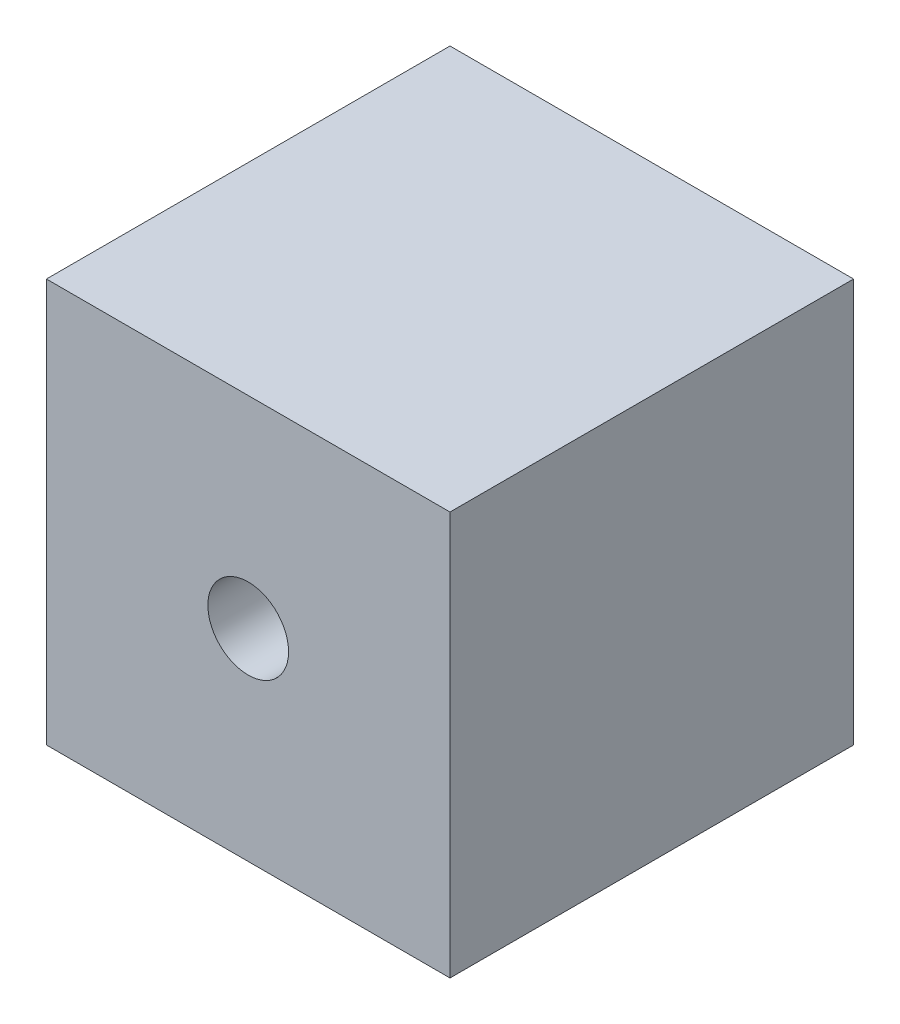
ISO-10303-21;
HEADER;
FILE_DESCRIPTION(('STEP AP214'),'2;1');
FILE_NAME('part.step','',(''),(''),'','','');
FILE_SCHEMA(('AUTOMOTIVE_DESIGN { 1 0 10303 214 1 1 1 1 }'));
ENDSEC;
DATA;
#1=APPLICATION_CONTEXT('core data for automotive mechanical design processes');
#2=APPLICATION_PROTOCOL_DEFINITION('international standard','automotive_design',2000,#1);
#3=PRODUCT_CONTEXT('',#1,'mechanical');
#4=PRODUCT('Part','Part','',(#3));
#5=PRODUCT_RELATED_PRODUCT_CATEGORY('part','',(#4));
#6=PRODUCT_DEFINITION_FORMATION('','',#4);
#7=PRODUCT_DEFINITION_CONTEXT('part definition',#1,'design');
#8=PRODUCT_DEFINITION('design','',#6,#7);
#9=PRODUCT_DEFINITION_SHAPE('','',#8);
#10=(LENGTH_UNIT() NAMED_UNIT(*) SI_UNIT(.MILLI.,.METRE.));
#11=(NAMED_UNIT(*) PLANE_ANGLE_UNIT() SI_UNIT($,.RADIAN.));
#12=(NAMED_UNIT(*) SI_UNIT($,.STERADIAN.) SOLID_ANGLE_UNIT());
#13=UNCERTAINTY_MEASURE_WITH_UNIT(LENGTH_MEASURE(1.E-05),#10,'distance_accuracy_value','');
#14=(GEOMETRIC_REPRESENTATION_CONTEXT(3) GLOBAL_UNCERTAINTY_ASSIGNED_CONTEXT((#13)) GLOBAL_UNIT_ASSIGNED_CONTEXT((#10,
#11,#12)) REPRESENTATION_CONTEXT('',''));
#15=CARTESIAN_POINT('',(0.,0.,0.));
#16=DIRECTION('',(0.,0.,1.));
#17=DIRECTION('',(1.,0.,0.));
#18=AXIS2_PLACEMENT_3D('',#15,#16,#17);
#19=CARTESIAN_POINT('',(0.,60.,0.));
#20=DIRECTION('',(1.,0.,0.));
#21=DIRECTION('',(0.,0.,-1.));
#22=AXIS2_PLACEMENT_3D('',#19,#20,#21);
#23=PLANE('',#22);
#24=CARTESIAN_POINT('',(0.,30.,-30.));
#25=DIRECTION('',(-1.,0.,0.));
#26=DIRECTION('',(0.,0.,1.));
#27=AXIS2_PLACEMENT_3D('',#24,#25,#26);
#28=CIRCLE('',#27,6.);
#29=CARTESIAN_POINT('',(0.,30.,-24.));
#30=VERTEX_POINT('',#29);
#31=EDGE_CURVE('E136',#30,#30,#28,.T.);
#32=ORIENTED_EDGE('',*,*,#31,.F.);
#33=EDGE_LOOP('',(#32));
#34=FACE_BOUND('',#33,.T.);
#35=DIRECTION('',(0.,0.,1.));
#36=VECTOR('',#35,1.);
#37=CARTESIAN_POINT('',(0.,0.,0.));
#38=LINE('',#37,#36);
#39=CARTESIAN_POINT('',(0.,0.,-60.));
#40=VERTEX_POINT('',#39);
#41=CARTESIAN_POINT('',(0.,0.,0.));
#42=VERTEX_POINT('',#41);
#43=EDGE_CURVE('E107',#40,#42,#38,.T.);
#44=ORIENTED_EDGE('',*,*,#43,.T.);
#45=DIRECTION('',(0.,-1.,0.));
#46=VECTOR('',#45,1.);
#47=CARTESIAN_POINT('',(0.,60.,0.));
#48=LINE('',#47,#46);
#49=CARTESIAN_POINT('',(0.,60.,0.));
#50=VERTEX_POINT('',#49);
#51=EDGE_CURVE('E11',#50,#42,#48,.T.);
#52=ORIENTED_EDGE('',*,*,#51,.F.);
#53=DIRECTION('',(0.,0.,1.));
#54=VECTOR('',#53,1.);
#55=CARTESIAN_POINT('',(0.,60.,0.));
#56=LINE('',#55,#54);
#57=CARTESIAN_POINT('',(0.,60.,-60.));
#58=VERTEX_POINT('',#57);
#59=EDGE_CURVE('E91',#58,#50,#56,.T.);
#60=ORIENTED_EDGE('',*,*,#59,.F.);
#61=DIRECTION('',(0.,-1.,0.));
#62=VECTOR('',#61,1.);
#63=CARTESIAN_POINT('',(0.,60.,-60.));
#64=LINE('',#63,#62);
#65=EDGE_CURVE('E103',#58,#40,#64,.T.);
#66=ORIENTED_EDGE('',*,*,#65,.T.);
#67=EDGE_LOOP('',(#44,#52,#60,#66));
#68=FACE_BOUND('',#67,.T.);
#69=ADVANCED_FACE('F39',(#34,#68),#23,.F.);
#70=CARTESIAN_POINT('',(0.,60.,0.));
#71=DIRECTION('',(0.,0.,-1.));
#72=DIRECTION('',(-1.,0.,0.));
#73=AXIS2_PLACEMENT_3D('',#70,#71,#72);
#74=PLANE('',#73);
#75=CARTESIAN_POINT('',(30.,30.,0.));
#76=DIRECTION('',(0.,0.,1.));
#77=DIRECTION('',(1.,0.,0.));
#78=AXIS2_PLACEMENT_3D('',#75,#76,#77);
#79=CIRCLE('',#78,6.);
#80=CARTESIAN_POINT('',(36.,30.,0.));
#81=VERTEX_POINT('',#80);
#82=EDGE_CURVE('E128',#81,#81,#79,.T.);
#83=ORIENTED_EDGE('',*,*,#82,.F.);
#84=EDGE_LOOP('',(#83));
#85=FACE_BOUND('',#84,.T.);
#86=DIRECTION('',(1.,0.,0.));
#87=VECTOR('',#86,1.);
#88=CARTESIAN_POINT('',(0.,0.,0.));
#89=LINE('',#88,#87);
#90=CARTESIAN_POINT('',(60.,0.,0.));
#91=VERTEX_POINT('',#90);
#92=EDGE_CURVE('E96',#42,#91,#89,.T.);
#93=ORIENTED_EDGE('',*,*,#92,.T.);
#94=DIRECTION('',(0.,-1.,0.));
#95=VECTOR('',#94,1.);
#96=CARTESIAN_POINT('',(60.,60.,0.));
#97=LINE('',#96,#95);
#98=CARTESIAN_POINT('',(60.,60.,0.));
#99=VERTEX_POINT('',#98);
#100=EDGE_CURVE('E48',#99,#91,#97,.T.);
#101=ORIENTED_EDGE('',*,*,#100,.F.);
#102=DIRECTION('',(1.,0.,0.));
#103=VECTOR('',#102,1.);
#104=CARTESIAN_POINT('',(0.,60.,0.));
#105=LINE('',#104,#103);
#106=EDGE_CURVE('E86',#50,#99,#105,.T.);
#107=ORIENTED_EDGE('',*,*,#106,.F.);
#108=ORIENTED_EDGE('',*,*,#51,.T.);
#109=EDGE_LOOP('',(#93,#101,#107,#108));
#110=FACE_BOUND('',#109,.T.);
#111=ADVANCED_FACE('F95',(#85,#110),#74,.F.);
#112=CARTESIAN_POINT('',(60.,60.,0.));
#113=DIRECTION('',(-1.,0.,0.));
#114=DIRECTION('',(0.,0.,1.));
#115=AXIS2_PLACEMENT_3D('',#112,#113,#114);
#116=PLANE('',#115);
#117=DIRECTION('',(0.,0.,-1.));
#118=VECTOR('',#117,1.);
#119=CARTESIAN_POINT('',(60.,0.,0.));
#120=LINE('',#119,#118);
#121=CARTESIAN_POINT('',(60.,0.,-60.));
#122=VERTEX_POINT('',#121);
#123=EDGE_CURVE('E73',#91,#122,#120,.T.);
#124=ORIENTED_EDGE('',*,*,#123,.T.);
#125=DIRECTION('',(0.,-1.,0.));
#126=VECTOR('',#125,1.);
#127=CARTESIAN_POINT('',(60.,60.,-60.));
#128=LINE('',#127,#126);
#129=CARTESIAN_POINT('',(60.,60.,-60.));
#130=VERTEX_POINT('',#129);
#131=EDGE_CURVE('E98',#130,#122,#128,.T.);
#132=ORIENTED_EDGE('',*,*,#131,.F.);
#133=DIRECTION('',(0.,0.,-1.));
#134=VECTOR('',#133,1.);
#135=CARTESIAN_POINT('',(60.,60.,0.));
#136=LINE('',#135,#134);
#137=EDGE_CURVE('E89',#99,#130,#136,.T.);
#138=ORIENTED_EDGE('',*,*,#137,.F.);
#139=ORIENTED_EDGE('',*,*,#100,.T.);
#140=EDGE_LOOP('',(#124,#132,#138,#139));
#141=FACE_BOUND('',#140,.T.);
#142=ADVANCED_FACE('F99',(#141),#116,.F.);
#143=CARTESIAN_POINT('',(0.,60.,-60.));
#144=DIRECTION('',(0.,0.,1.));
#145=DIRECTION('',(1.,0.,0.));
#146=AXIS2_PLACEMENT_3D('',#143,#144,#145);
#147=PLANE('',#146);
#148=DIRECTION('',(-1.,0.,0.));
#149=VECTOR('',#148,1.);
#150=CARTESIAN_POINT('',(0.,0.,-60.));
#151=LINE('',#150,#149);
#152=EDGE_CURVE('E79',#122,#40,#151,.T.);
#153=ORIENTED_EDGE('',*,*,#152,.T.);
#154=ORIENTED_EDGE('',*,*,#65,.F.);
#155=DIRECTION('',(-1.,0.,0.));
#156=VECTOR('',#155,1.);
#157=CARTESIAN_POINT('',(0.,60.,-60.));
#158=LINE('',#157,#156);
#159=EDGE_CURVE('E56',#130,#58,#158,.T.);
#160=ORIENTED_EDGE('',*,*,#159,.F.);
#161=ORIENTED_EDGE('',*,*,#131,.T.);
#162=EDGE_LOOP('',(#153,#154,#160,#161));
#163=FACE_BOUND('',#162,.T.);
#164=ADVANCED_FACE('F121',(#163),#147,.F.);
#165=CARTESIAN_POINT('',(0.,60.,0.));
#166=DIRECTION('',(0.,-1.,0.));
#167=DIRECTION('',(0.,0.,-1.));
#168=AXIS2_PLACEMENT_3D('',#165,#166,#167);
#169=PLANE('',#168);
#170=ORIENTED_EDGE('',*,*,#59,.T.);
#171=ORIENTED_EDGE('',*,*,#106,.T.);
#172=ORIENTED_EDGE('',*,*,#137,.T.);
#173=ORIENTED_EDGE('',*,*,#159,.T.);
#174=EDGE_LOOP('',(#170,#171,#172,#173));
#175=FACE_BOUND('',#174,.T.);
#176=ADVANCED_FACE('F87',(#175),#169,.F.);
#177=CARTESIAN_POINT('',(0.,0.,0.));
#178=DIRECTION('',(0.,-1.,0.));
#179=DIRECTION('',(0.,0.,-1.));
#180=AXIS2_PLACEMENT_3D('',#177,#178,#179);
#181=PLANE('',#180);
#182=ORIENTED_EDGE('',*,*,#43,.F.);
#183=ORIENTED_EDGE('',*,*,#152,.F.);
#184=ORIENTED_EDGE('',*,*,#123,.F.);
#185=ORIENTED_EDGE('',*,*,#92,.F.);
#186=EDGE_LOOP('',(#182,#183,#184,#185));
#187=FACE_BOUND('',#186,.T.);
#188=ADVANCED_FACE('F124',(#187),#181,.T.);
#189=CARTESIAN_POINT('',(30.,30.,-20.));
#190=DIRECTION('',(0.,0.,1.));
#191=DIRECTION('',(1.,0.,0.));
#192=AXIS2_PLACEMENT_3D('',#189,#190,#191);
#193=CYLINDRICAL_SURFACE('',#192,6.);
#194=CARTESIAN_POINT('',(30.,30.,-20.));
#195=DIRECTION('',(0.,0.,1.));
#196=DIRECTION('',(1.,0.,0.));
#197=AXIS2_PLACEMENT_3D('',#194,#195,#196);
#198=CIRCLE('',#197,6.);
#199=CARTESIAN_POINT('',(36.,30.,-20.));
#200=VERTEX_POINT('',#199);
#201=EDGE_CURVE('E111',#200,#200,#198,.T.);
#202=ORIENTED_EDGE('',*,*,#201,.F.);
#203=EDGE_LOOP('',(#202));
#204=FACE_BOUND('',#203,.T.);
#205=ORIENTED_EDGE('',*,*,#82,.T.);
#206=EDGE_LOOP('',(#205));
#207=FACE_BOUND('',#206,.T.);
#208=ADVANCED_FACE('F168',(#204,#207),#193,.F.);
#209=CARTESIAN_POINT('',(30.,30.,-20.));
#210=DIRECTION('',(0.,0.,1.));
#211=DIRECTION('',(1.,0.,0.));
#212=AXIS2_PLACEMENT_3D('',#209,#210,#211);
#213=PLANE('',#212);
#214=ORIENTED_EDGE('',*,*,#201,.T.);
#215=EDGE_LOOP('',(#214));
#216=FACE_BOUND('',#215,.T.);
#217=ADVANCED_FACE('F149',(#216),#213,.T.);
#218=CARTESIAN_POINT('',(20.,30.,-30.));
#219=DIRECTION('',(-1.,0.,0.));
#220=DIRECTION('',(0.,0.,1.));
#221=AXIS2_PLACEMENT_3D('',#218,#219,#220);
#222=CYLINDRICAL_SURFACE('',#221,6.);
#223=CARTESIAN_POINT('',(20.,30.,-30.));
#224=DIRECTION('',(-1.,0.,0.));
#225=DIRECTION('',(0.,0.,1.));
#226=AXIS2_PLACEMENT_3D('',#223,#224,#225);
#227=CIRCLE('',#226,6.);
#228=CARTESIAN_POINT('',(20.,30.,-24.));
#229=VERTEX_POINT('',#228);
#230=EDGE_CURVE('E132',#229,#229,#227,.T.);
#231=ORIENTED_EDGE('',*,*,#230,.F.);
#232=EDGE_LOOP('',(#231));
#233=FACE_BOUND('',#232,.T.);
#234=ORIENTED_EDGE('',*,*,#31,.T.);
#235=EDGE_LOOP('',(#234));
#236=FACE_BOUND('',#235,.T.);
#237=ADVANCED_FACE('F146',(#233,#236),#222,.F.);
#238=CARTESIAN_POINT('',(20.,30.,-30.));
#239=DIRECTION('',(-1.,0.,0.));
#240=DIRECTION('',(0.,0.,1.));
#241=AXIS2_PLACEMENT_3D('',#238,#239,#240);
#242=PLANE('',#241);
#243=ORIENTED_EDGE('',*,*,#230,.T.);
#244=EDGE_LOOP('',(#243));
#245=FACE_BOUND('',#244,.T.);
#246=ADVANCED_FACE('F144',(#245),#242,.T.);
#247=CLOSED_SHELL('',(#69,#111,#142,#164,#176,#188,#208,#217,#237,#246));
#248=MANIFOLD_SOLID_BREP('B2',#247);
#249=ADVANCED_BREP_SHAPE_REPRESENTATION('',(#18,#248),#14);
#250=SHAPE_DEFINITION_REPRESENTATION(#9,#249);
ENDSEC;
END-ISO-10303-21;
